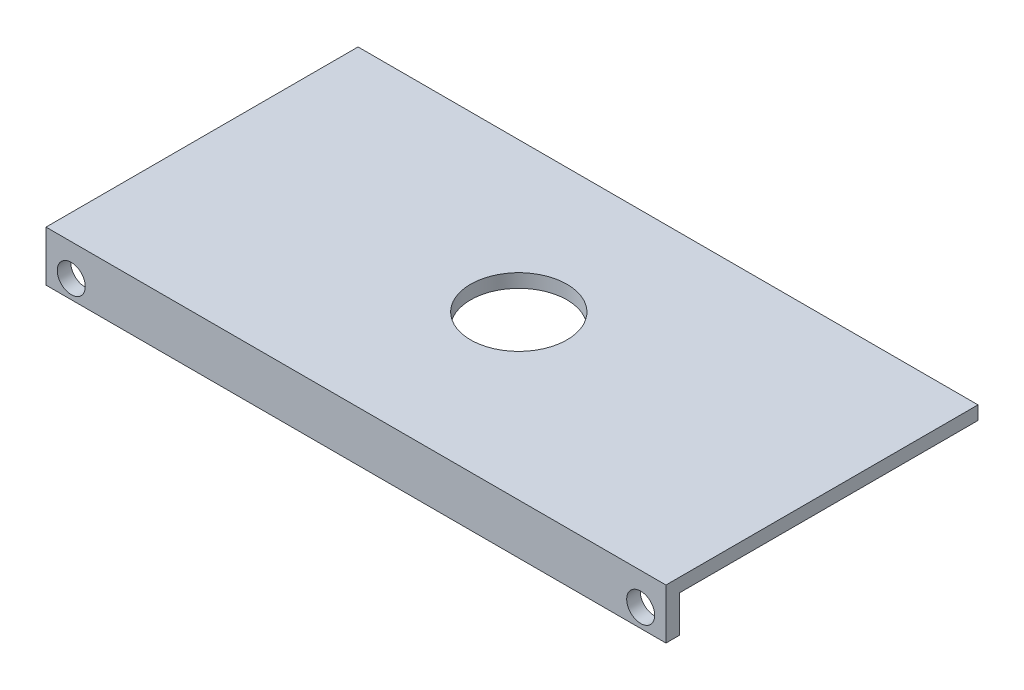
ISO-10303-21;
HEADER;
FILE_DESCRIPTION(('STEP AP214'),'2;1');
FILE_NAME('part.step','',(''),(''),'','','');
FILE_SCHEMA(('AUTOMOTIVE_DESIGN { 1 0 10303 214 1 1 1 1 }'));
ENDSEC;
DATA;
#1=APPLICATION_CONTEXT('core data for automotive mechanical design processes');
#2=APPLICATION_PROTOCOL_DEFINITION('international standard','automotive_design',2000,#1);
#3=PRODUCT_CONTEXT('',#1,'mechanical');
#4=PRODUCT('Part','Part','',(#3));
#5=PRODUCT_RELATED_PRODUCT_CATEGORY('part','',(#4));
#6=PRODUCT_DEFINITION_FORMATION('','',#4);
#7=PRODUCT_DEFINITION_CONTEXT('part definition',#1,'design');
#8=PRODUCT_DEFINITION('design','',#6,#7);
#9=PRODUCT_DEFINITION_SHAPE('','',#8);
#10=(LENGTH_UNIT() NAMED_UNIT(*) SI_UNIT(.MILLI.,.METRE.));
#11=(NAMED_UNIT(*) PLANE_ANGLE_UNIT() SI_UNIT($,.RADIAN.));
#12=(NAMED_UNIT(*) SI_UNIT($,.STERADIAN.) SOLID_ANGLE_UNIT());
#13=UNCERTAINTY_MEASURE_WITH_UNIT(LENGTH_MEASURE(1.E-05),#10,'distance_accuracy_value','');
#14=(GEOMETRIC_REPRESENTATION_CONTEXT(3) GLOBAL_UNCERTAINTY_ASSIGNED_CONTEXT((#13)) GLOBAL_UNIT_ASSIGNED_CONTEXT((#10,
#11,#12)) REPRESENTATION_CONTEXT('',''));
#15=CARTESIAN_POINT('',(0.,0.,0.));
#16=DIRECTION('',(0.,0.,1.));
#17=DIRECTION('',(1.,0.,0.));
#18=AXIS2_PLACEMENT_3D('',#15,#16,#17);
#19=CARTESIAN_POINT('',(0.,0.,0.));
#20=DIRECTION('',(0.,0.,1.));
#21=DIRECTION('',(1.,0.,0.));
#22=AXIS2_PLACEMENT_3D('',#19,#20,#21);
#23=PLANE('',#22);
#24=CARTESIAN_POINT('',(31.496,0.,0.));
#25=DIRECTION('',(0.,0.,1.));
#26=DIRECTION('',(1.,0.,0.));
#27=AXIS2_PLACEMENT_3D('',#24,#25,#26);
#28=CIRCLE('',#27,1.55);
#29=CARTESIAN_POINT('',(33.046,0.,0.));
#30=VERTEX_POINT('',#29);
#31=EDGE_CURVE('E127',#30,#30,#28,.T.);
#32=ORIENTED_EDGE('',*,*,#31,.T.);
#33=EDGE_LOOP('',(#32));
#34=FACE_BOUND('',#33,.T.);
#35=CARTESIAN_POINT('',(-31.496,0.,0.));
#36=DIRECTION('',(0.,0.,1.));
#37=DIRECTION('',(1.,0.,0.));
#38=AXIS2_PLACEMENT_3D('',#35,#36,#37);
#39=CIRCLE('',#38,1.55);
#40=CARTESIAN_POINT('',(-29.946,0.,0.));
#41=VERTEX_POINT('',#40);
#42=EDGE_CURVE('E121',#41,#41,#39,.T.);
#43=ORIENTED_EDGE('',*,*,#42,.T.);
#44=EDGE_LOOP('',(#43));
#45=FACE_BOUND('',#44,.T.);
#46=DIRECTION('',(-1.,0.,0.));
#47=VECTOR('',#46,1.);
#48=CARTESIAN_POINT('',(34.29,2.03200000000001,0.));
#49=LINE('',#48,#47);
#50=CARTESIAN_POINT('',(34.29,2.03200000000001,0.));
#51=VERTEX_POINT('',#50);
#52=CARTESIAN_POINT('',(-34.29,2.03200000000001,0.));
#53=VERTEX_POINT('',#52);
#54=EDGE_CURVE('E80',#51,#53,#49,.T.);
#55=ORIENTED_EDGE('',*,*,#54,.F.);
#56=DIRECTION('',(0.,1.,0.));
#57=VECTOR('',#56,1.);
#58=CARTESIAN_POINT('',(34.29,-2.032,0.));
#59=LINE('',#58,#57);
#60=CARTESIAN_POINT('',(34.29,-2.032,0.));
#61=VERTEX_POINT('',#60);
#62=EDGE_CURVE('E99',#61,#51,#59,.T.);
#63=ORIENTED_EDGE('',*,*,#62,.F.);
#64=DIRECTION('',(-1.,0.,0.));
#65=VECTOR('',#64,1.);
#66=CARTESIAN_POINT('',(34.29,-2.032,0.));
#67=LINE('',#66,#65);
#68=CARTESIAN_POINT('',(-34.29,-2.032,0.));
#69=VERTEX_POINT('',#68);
#70=EDGE_CURVE('E107',#61,#69,#67,.T.);
#71=ORIENTED_EDGE('',*,*,#70,.T.);
#72=DIRECTION('',(0.,1.,0.));
#73=VECTOR('',#72,1.);
#74=CARTESIAN_POINT('',(-34.29,-2.032,0.));
#75=LINE('',#74,#73);
#76=EDGE_CURVE('E108',#69,#53,#75,.T.);
#77=ORIENTED_EDGE('',*,*,#76,.T.);
#78=EDGE_LOOP('',(#55,#63,#71,#77));
#79=FACE_BOUND('',#78,.T.);
#80=ADVANCED_FACE('F65',(#34,#45,#79),#23,.F.);
#81=CARTESIAN_POINT('',(0.,0.,1.5));
#82=DIRECTION('',(0.,0.,1.));
#83=DIRECTION('',(1.,0.,0.));
#84=AXIS2_PLACEMENT_3D('',#81,#82,#83);
#85=PLANE('',#84);
#86=CARTESIAN_POINT('',(-31.496,0.,1.5));
#87=DIRECTION('',(0.,0.,1.));
#88=DIRECTION('',(1.,0.,0.));
#89=AXIS2_PLACEMENT_3D('',#86,#87,#88);
#90=CIRCLE('',#89,1.55);
#91=CARTESIAN_POINT('',(-29.946,0.,1.5));
#92=VERTEX_POINT('',#91);
#93=EDGE_CURVE('E109',#92,#92,#90,.T.);
#94=ORIENTED_EDGE('',*,*,#93,.F.);
#95=EDGE_LOOP('',(#94));
#96=FACE_BOUND('',#95,.T.);
#97=DIRECTION('',(0.,1.,0.));
#98=VECTOR('',#97,1.);
#99=CARTESIAN_POINT('',(34.29,-2.032,1.5));
#100=LINE('',#99,#98);
#101=CARTESIAN_POINT('',(34.29,-2.032,1.5));
#102=VERTEX_POINT('',#101);
#103=CARTESIAN_POINT('',(34.29,3.53200000000001,1.5));
#104=VERTEX_POINT('',#103);
#105=EDGE_CURVE('E103',#102,#104,#100,.T.);
#106=ORIENTED_EDGE('',*,*,#105,.T.);
#107=DIRECTION('',(1.,0.,0.));
#108=VECTOR('',#107,1.);
#109=CARTESIAN_POINT('',(-34.29,3.532,1.5));
#110=LINE('',#109,#108);
#111=CARTESIAN_POINT('',(-34.29,3.532,1.5));
#112=VERTEX_POINT('',#111);
#113=EDGE_CURVE('E135',#112,#104,#110,.T.);
#114=ORIENTED_EDGE('',*,*,#113,.F.);
#115=DIRECTION('',(0.,1.,0.));
#116=VECTOR('',#115,1.);
#117=CARTESIAN_POINT('',(-34.29,-2.032,1.5));
#118=LINE('',#117,#116);
#119=CARTESIAN_POINT('',(-34.29,-2.032,1.5));
#120=VERTEX_POINT('',#119);
#121=EDGE_CURVE('E114',#120,#112,#118,.T.);
#122=ORIENTED_EDGE('',*,*,#121,.F.);
#123=DIRECTION('',(-1.,0.,0.));
#124=VECTOR('',#123,1.);
#125=CARTESIAN_POINT('',(34.29,-2.032,1.5));
#126=LINE('',#125,#124);
#127=EDGE_CURVE('E105',#102,#120,#126,.T.);
#128=ORIENTED_EDGE('',*,*,#127,.F.);
#129=EDGE_LOOP('',(#106,#114,#122,#128));
#130=FACE_BOUND('',#129,.T.);
#131=CARTESIAN_POINT('',(31.496,0.,1.5));
#132=DIRECTION('',(0.,0.,1.));
#133=DIRECTION('',(1.,0.,0.));
#134=AXIS2_PLACEMENT_3D('',#131,#132,#133);
#135=CIRCLE('',#134,1.55);
#136=CARTESIAN_POINT('',(33.046,0.,1.5));
#137=VERTEX_POINT('',#136);
#138=EDGE_CURVE('E124',#137,#137,#135,.T.);
#139=ORIENTED_EDGE('',*,*,#138,.F.);
#140=EDGE_LOOP('',(#139));
#141=FACE_BOUND('',#140,.T.);
#142=ADVANCED_FACE('F199',(#96,#130,#141),#85,.T.);
#143=CARTESIAN_POINT('',(34.29,-2.032,1.5));
#144=DIRECTION('',(-1.,0.,0.));
#145=DIRECTION('',(0.,0.,1.));
#146=AXIS2_PLACEMENT_3D('',#143,#144,#145);
#147=PLANE('',#146);
#148=ORIENTED_EDGE('',*,*,#62,.T.);
#149=DIRECTION('',(0.,0.,1.));
#150=VECTOR('',#149,1.);
#151=CARTESIAN_POINT('',(34.29,2.03200000000001,-33.02));
#152=LINE('',#151,#150);
#153=CARTESIAN_POINT('',(34.29,2.03200000000001,-33.02));
#154=VERTEX_POINT('',#153);
#155=EDGE_CURVE('E141',#154,#51,#152,.T.);
#156=ORIENTED_EDGE('',*,*,#155,.F.);
#157=DIRECTION('',(0.,-1.,0.));
#158=VECTOR('',#157,1.);
#159=CARTESIAN_POINT('',(34.29,3.53200000000001,-33.02));
#160=LINE('',#159,#158);
#161=CARTESIAN_POINT('',(34.29,3.53200000000001,-33.02));
#162=VERTEX_POINT('',#161);
#163=EDGE_CURVE('E148',#162,#154,#160,.T.);
#164=ORIENTED_EDGE('',*,*,#163,.F.);
#165=DIRECTION('',(0.,0.,-1.));
#166=VECTOR('',#165,1.);
#167=CARTESIAN_POINT('',(34.29,3.53200000000001,0.));
#168=LINE('',#167,#166);
#169=EDGE_CURVE('E130',#104,#162,#168,.T.);
#170=ORIENTED_EDGE('',*,*,#169,.F.);
#171=ORIENTED_EDGE('',*,*,#105,.F.);
#172=DIRECTION('',(0.,0.,-1.));
#173=VECTOR('',#172,1.);
#174=CARTESIAN_POINT('',(34.29,-2.032,1.5));
#175=LINE('',#174,#173);
#176=EDGE_CURVE('E73',#102,#61,#175,.T.);
#177=ORIENTED_EDGE('',*,*,#176,.T.);
#178=EDGE_LOOP('',(#148,#156,#164,#170,#171,#177));
#179=FACE_BOUND('',#178,.T.);
#180=ADVANCED_FACE('F67',(#179),#147,.F.);
#181=CARTESIAN_POINT('',(-34.29,-2.032,1.5));
#182=DIRECTION('',(-1.,0.,0.));
#183=DIRECTION('',(0.,0.,1.));
#184=AXIS2_PLACEMENT_3D('',#181,#182,#183);
#185=PLANE('',#184);
#186=ORIENTED_EDGE('',*,*,#76,.F.);
#187=DIRECTION('',(0.,0.,-1.));
#188=VECTOR('',#187,1.);
#189=CARTESIAN_POINT('',(-34.29,-2.032,1.5));
#190=LINE('',#189,#188);
#191=EDGE_CURVE('E12',#120,#69,#190,.T.);
#192=ORIENTED_EDGE('',*,*,#191,.F.);
#193=ORIENTED_EDGE('',*,*,#121,.T.);
#194=DIRECTION('',(0.,0.,1.));
#195=VECTOR('',#194,1.);
#196=CARTESIAN_POINT('',(-34.29,3.532,0.));
#197=LINE('',#196,#195);
#198=CARTESIAN_POINT('',(-34.29,3.53200000000001,-33.02));
#199=VERTEX_POINT('',#198);
#200=EDGE_CURVE('E138',#199,#112,#197,.T.);
#201=ORIENTED_EDGE('',*,*,#200,.F.);
#202=DIRECTION('',(0.,1.,0.));
#203=VECTOR('',#202,1.);
#204=CARTESIAN_POINT('',(-34.29,3.53200000000001,-33.02));
#205=LINE('',#204,#203);
#206=CARTESIAN_POINT('',(-34.29,2.03200000000001,-33.02));
#207=VERTEX_POINT('',#206);
#208=EDGE_CURVE('E152',#207,#199,#205,.T.);
#209=ORIENTED_EDGE('',*,*,#208,.F.);
#210=DIRECTION('',(0.,0.,1.));
#211=VECTOR('',#210,1.);
#212=CARTESIAN_POINT('',(-34.29,2.03200000000001,-33.02));
#213=LINE('',#212,#211);
#214=EDGE_CURVE('E143',#207,#53,#213,.T.);
#215=ORIENTED_EDGE('',*,*,#214,.T.);
#216=EDGE_LOOP('',(#186,#192,#193,#201,#209,#215));
#217=FACE_BOUND('',#216,.T.);
#218=ADVANCED_FACE('F182',(#217),#185,.T.);
#219=CARTESIAN_POINT('',(34.29,-2.032,1.5));
#220=DIRECTION('',(0.,-1.,0.));
#221=DIRECTION('',(1.,0.,0.));
#222=AXIS2_PLACEMENT_3D('',#219,#220,#221);
#223=PLANE('',#222);
#224=ORIENTED_EDGE('',*,*,#70,.F.);
#225=ORIENTED_EDGE('',*,*,#176,.F.);
#226=ORIENTED_EDGE('',*,*,#127,.T.);
#227=ORIENTED_EDGE('',*,*,#191,.T.);
#228=EDGE_LOOP('',(#224,#225,#226,#227));
#229=FACE_BOUND('',#228,.T.);
#230=ADVANCED_FACE('F111',(#229),#223,.T.);
#231=CARTESIAN_POINT('',(-31.496,0.,1.5));
#232=DIRECTION('',(0.,0.,-1.));
#233=DIRECTION('',(-1.,0.,0.));
#234=AXIS2_PLACEMENT_3D('',#231,#232,#233);
#235=CYLINDRICAL_SURFACE('',#234,1.55);
#236=ORIENTED_EDGE('',*,*,#93,.T.);
#237=EDGE_LOOP('',(#236));
#238=FACE_BOUND('',#237,.T.);
#239=ORIENTED_EDGE('',*,*,#42,.F.);
#240=EDGE_LOOP('',(#239));
#241=FACE_BOUND('',#240,.T.);
#242=ADVANCED_FACE('F209',(#238,#241),#235,.F.);
#243=CARTESIAN_POINT('',(31.496,0.,1.5));
#244=DIRECTION('',(0.,0.,-1.));
#245=DIRECTION('',(-1.,0.,0.));
#246=AXIS2_PLACEMENT_3D('',#243,#244,#245);
#247=CYLINDRICAL_SURFACE('',#246,1.55);
#248=ORIENTED_EDGE('',*,*,#138,.T.);
#249=EDGE_LOOP('',(#248));
#250=FACE_BOUND('',#249,.T.);
#251=ORIENTED_EDGE('',*,*,#31,.F.);
#252=EDGE_LOOP('',(#251));
#253=FACE_BOUND('',#252,.T.);
#254=ADVANCED_FACE('F206',(#250,#253),#247,.F.);
#255=CARTESIAN_POINT('',(0.,3.532,0.));
#256=DIRECTION('',(0.,1.,0.));
#257=DIRECTION('',(-1.,0.,0.));
#258=AXIS2_PLACEMENT_3D('',#255,#256,#257);
#259=PLANE('',#258);
#260=CARTESIAN_POINT('',(0.,3.532,-16.51));
#261=DIRECTION('',(0.,1.,0.));
#262=DIRECTION('',(-1.,0.,0.));
#263=AXIS2_PLACEMENT_3D('',#260,#261,#262);
#264=CIRCLE('',#263,5.334);
#265=CARTESIAN_POINT('',(-5.33399999999999,3.532,-16.51));
#266=VERTEX_POINT('',#265);
#267=EDGE_CURVE('E149',#266,#266,#264,.T.);
#268=ORIENTED_EDGE('',*,*,#267,.F.);
#269=EDGE_LOOP('',(#268));
#270=FACE_BOUND('',#269,.T.);
#271=ORIENTED_EDGE('',*,*,#200,.T.);
#272=ORIENTED_EDGE('',*,*,#113,.T.);
#273=ORIENTED_EDGE('',*,*,#169,.T.);
#274=DIRECTION('',(1.,0.,0.));
#275=VECTOR('',#274,1.);
#276=CARTESIAN_POINT('',(34.29,3.53200000000001,-33.02));
#277=LINE('',#276,#275);
#278=EDGE_CURVE('E146',#199,#162,#277,.T.);
#279=ORIENTED_EDGE('',*,*,#278,.F.);
#280=EDGE_LOOP('',(#271,#272,#273,#279));
#281=FACE_BOUND('',#280,.T.);
#282=ADVANCED_FACE('F172',(#270,#281),#259,.T.);
#283=CARTESIAN_POINT('',(34.29,2.03200000000001,-33.02));
#284=DIRECTION('',(0.,1.,0.));
#285=DIRECTION('',(0.,0.,1.));
#286=AXIS2_PLACEMENT_3D('',#283,#284,#285);
#287=PLANE('',#286);
#288=CARTESIAN_POINT('',(0.,2.03200000000001,-16.51));
#289=DIRECTION('',(0.,-1.,0.));
#290=DIRECTION('',(0.,0.,-1.));
#291=AXIS2_PLACEMENT_3D('',#288,#289,#290);
#292=CIRCLE('',#291,5.334);
#293=CARTESIAN_POINT('',(0.,2.03200000000001,-21.844));
#294=VERTEX_POINT('',#293);
#295=EDGE_CURVE('E162',#294,#294,#292,.T.);
#296=ORIENTED_EDGE('',*,*,#295,.F.);
#297=EDGE_LOOP('',(#296));
#298=FACE_BOUND('',#297,.T.);
#299=ORIENTED_EDGE('',*,*,#54,.T.);
#300=ORIENTED_EDGE('',*,*,#214,.F.);
#301=DIRECTION('',(-1.,0.,0.));
#302=VECTOR('',#301,1.);
#303=CARTESIAN_POINT('',(34.29,2.03200000000001,-33.02));
#304=LINE('',#303,#302);
#305=EDGE_CURVE('E155',#154,#207,#304,.T.);
#306=ORIENTED_EDGE('',*,*,#305,.F.);
#307=ORIENTED_EDGE('',*,*,#155,.T.);
#308=EDGE_LOOP('',(#299,#300,#306,#307));
#309=FACE_BOUND('',#308,.T.);
#310=ADVANCED_FACE('F168',(#298,#309),#287,.F.);
#311=CARTESIAN_POINT('',(0.,0.,-33.02));
#312=DIRECTION('',(0.,0.,-1.));
#313=DIRECTION('',(-1.,0.,0.));
#314=AXIS2_PLACEMENT_3D('',#311,#312,#313);
#315=PLANE('',#314);
#316=ORIENTED_EDGE('',*,*,#163,.T.);
#317=ORIENTED_EDGE('',*,*,#305,.T.);
#318=ORIENTED_EDGE('',*,*,#208,.T.);
#319=ORIENTED_EDGE('',*,*,#278,.T.);
#320=EDGE_LOOP('',(#316,#317,#318,#319));
#321=FACE_BOUND('',#320,.T.);
#322=ADVANCED_FACE('F171',(#321),#315,.T.);
#323=CARTESIAN_POINT('',(0.,35.052,-16.51));
#324=DIRECTION('',(0.,-1.,0.));
#325=DIRECTION('',(0.,0.,-1.));
#326=AXIS2_PLACEMENT_3D('',#323,#324,#325);
#327=CYLINDRICAL_SURFACE('',#326,5.334);
#328=ORIENTED_EDGE('',*,*,#267,.T.);
#329=EDGE_LOOP('',(#328));
#330=FACE_BOUND('',#329,.T.);
#331=ORIENTED_EDGE('',*,*,#295,.T.);
#332=EDGE_LOOP('',(#331));
#333=FACE_BOUND('',#332,.T.);
#334=ADVANCED_FACE('F166',(#330,#333),#327,.F.);
#335=CLOSED_SHELL('',(#80,#142,#180,#218,#230,#242,#254,#282,#310,#322,#334));
#336=MANIFOLD_SOLID_BREP('B2',#335);
#337=ADVANCED_BREP_SHAPE_REPRESENTATION('',(#18,#336),#14);
#338=SHAPE_DEFINITION_REPRESENTATION(#9,#337);
ENDSEC;
END-ISO-10303-21;
